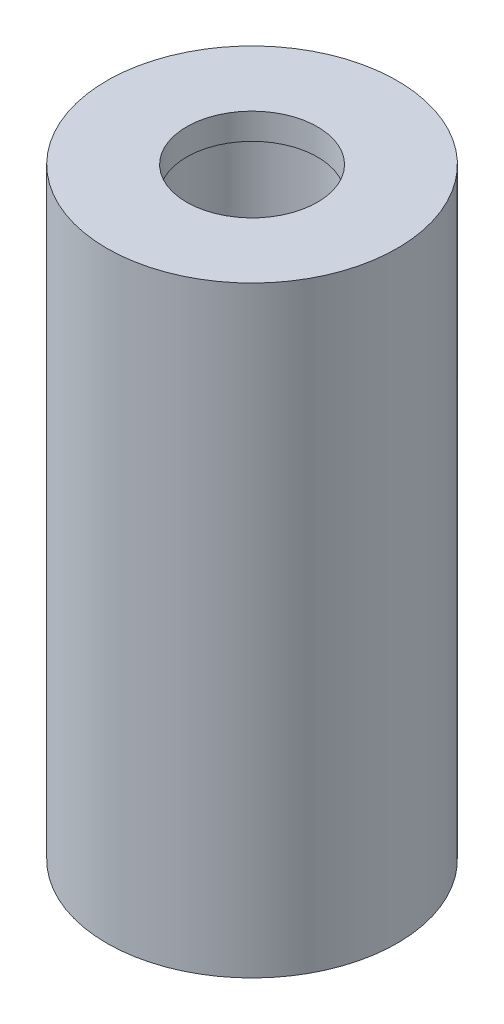
ISO-10303-21;
HEADER;
FILE_DESCRIPTION(('STEP AP214'),'2;1');
FILE_NAME('part.step','',(''),(''),'','','');
FILE_SCHEMA(('AUTOMOTIVE_DESIGN { 1 0 10303 214 1 1 1 1 }'));
ENDSEC;
DATA;
#1=APPLICATION_CONTEXT('core data for automotive mechanical design processes');
#2=APPLICATION_PROTOCOL_DEFINITION('international standard','automotive_design',2000,#1);
#3=PRODUCT_CONTEXT('',#1,'mechanical');
#4=PRODUCT('Part','Part','',(#3));
#5=PRODUCT_RELATED_PRODUCT_CATEGORY('part','',(#4));
#6=PRODUCT_DEFINITION_FORMATION('','',#4);
#7=PRODUCT_DEFINITION_CONTEXT('part definition',#1,'design');
#8=PRODUCT_DEFINITION('design','',#6,#7);
#9=PRODUCT_DEFINITION_SHAPE('','',#8);
#10=(LENGTH_UNIT() NAMED_UNIT(*) SI_UNIT(.MILLI.,.METRE.));
#11=(NAMED_UNIT(*) PLANE_ANGLE_UNIT() SI_UNIT($,.RADIAN.));
#12=(NAMED_UNIT(*) SI_UNIT($,.STERADIAN.) SOLID_ANGLE_UNIT());
#13=UNCERTAINTY_MEASURE_WITH_UNIT(LENGTH_MEASURE(1.E-05),#10,'distance_accuracy_value','');
#14=(GEOMETRIC_REPRESENTATION_CONTEXT(3) GLOBAL_UNCERTAINTY_ASSIGNED_CONTEXT((#13)) GLOBAL_UNIT_ASSIGNED_CONTEXT((#10,
#11,#12)) REPRESENTATION_CONTEXT('',''));
#15=CARTESIAN_POINT('',(0.,0.,0.));
#16=DIRECTION('',(0.,0.,1.));
#17=DIRECTION('',(1.,0.,0.));
#18=AXIS2_PLACEMENT_3D('',#15,#16,#17);
#19=CARTESIAN_POINT('',(0.,23.,0.));
#20=DIRECTION('',(0.,-1.,0.));
#21=DIRECTION('',(0.,0.,-1.));
#22=AXIS2_PLACEMENT_3D('',#19,#20,#21);
#23=CYLINDRICAL_SURFACE('',#22,2.55);
#24=CARTESIAN_POINT('',(0.,0.,0.));
#25=DIRECTION('',(0.,1.,0.));
#26=DIRECTION('',(0.,0.,1.));
#27=AXIS2_PLACEMENT_3D('',#24,#25,#26);
#28=CIRCLE('',#27,2.55);
#29=CARTESIAN_POINT('',(0.,0.,2.55));
#30=VERTEX_POINT('',#29);
#31=EDGE_CURVE('E56',#30,#30,#28,.T.);
#32=ORIENTED_EDGE('',*,*,#31,.F.);
#33=EDGE_LOOP('',(#32));
#34=FACE_BOUND('',#33,.T.);
#35=CARTESIAN_POINT('',(0.,22.,0.));
#36=DIRECTION('',(0.,1.,0.));
#37=DIRECTION('',(0.,0.,1.));
#38=AXIS2_PLACEMENT_3D('',#35,#36,#37);
#39=CIRCLE('',#38,2.55);
#40=CARTESIAN_POINT('',(0.,22.,2.55));
#41=VERTEX_POINT('',#40);
#42=EDGE_CURVE('E61',#41,#41,#39,.T.);
#43=ORIENTED_EDGE('',*,*,#42,.T.);
#44=EDGE_LOOP('',(#43));
#45=FACE_BOUND('',#44,.T.);
#46=ADVANCED_FACE('F43',(#34,#45),#23,.F.);
#47=CARTESIAN_POINT('',(0.,23.,0.));
#48=DIRECTION('',(0.,1.,0.));
#49=DIRECTION('',(0.,0.,1.));
#50=AXIS2_PLACEMENT_3D('',#47,#48,#49);
#51=PLANE('',#50);
#52=CARTESIAN_POINT('',(0.,23.,0.));
#53=DIRECTION('',(0.,1.,0.));
#54=DIRECTION('',(0.,0.,1.));
#55=AXIS2_PLACEMENT_3D('',#52,#53,#54);
#56=CIRCLE('',#55,5.55);
#57=CARTESIAN_POINT('',(0.,23.,5.55));
#58=VERTEX_POINT('',#57);
#59=EDGE_CURVE('E10',#58,#58,#56,.T.);
#60=ORIENTED_EDGE('',*,*,#59,.T.);
#61=EDGE_LOOP('',(#60));
#62=FACE_BOUND('',#61,.T.);
#63=CARTESIAN_POINT('',(0.,23.,0.));
#64=DIRECTION('',(0.,1.,0.));
#65=DIRECTION('',(0.,0.,1.));
#66=AXIS2_PLACEMENT_3D('',#63,#64,#65);
#67=CIRCLE('',#66,2.5);
#68=CARTESIAN_POINT('',(0.,23.,2.5));
#69=VERTEX_POINT('',#68);
#70=EDGE_CURVE('E66',#69,#69,#67,.T.);
#71=ORIENTED_EDGE('',*,*,#70,.F.);
#72=EDGE_LOOP('',(#71));
#73=FACE_BOUND('',#72,.T.);
#74=ADVANCED_FACE('F83',(#62,#73),#51,.T.);
#75=CARTESIAN_POINT('',(0.,0.,0.));
#76=DIRECTION('',(0.,1.,0.));
#77=DIRECTION('',(0.,0.,1.));
#78=AXIS2_PLACEMENT_3D('',#75,#76,#77);
#79=PLANE('',#78);
#80=CARTESIAN_POINT('',(0.,0.,0.));
#81=DIRECTION('',(0.,1.,0.));
#82=DIRECTION('',(0.,0.,1.));
#83=AXIS2_PLACEMENT_3D('',#80,#81,#82);
#84=CIRCLE('',#83,5.55);
#85=CARTESIAN_POINT('',(0.,0.,5.55));
#86=VERTEX_POINT('',#85);
#87=EDGE_CURVE('E47',#86,#86,#84,.T.);
#88=ORIENTED_EDGE('',*,*,#87,.F.);
#89=EDGE_LOOP('',(#88));
#90=FACE_BOUND('',#89,.T.);
#91=ORIENTED_EDGE('',*,*,#31,.T.);
#92=EDGE_LOOP('',(#91));
#93=FACE_BOUND('',#92,.T.);
#94=ADVANCED_FACE('F85',(#90,#93),#79,.F.);
#95=CARTESIAN_POINT('',(0.,23.,0.));
#96=DIRECTION('',(0.,-1.,0.));
#97=DIRECTION('',(0.,0.,-1.));
#98=AXIS2_PLACEMENT_3D('',#95,#96,#97);
#99=CYLINDRICAL_SURFACE('',#98,5.55);
#100=ORIENTED_EDGE('',*,*,#59,.F.);
#101=EDGE_LOOP('',(#100));
#102=FACE_BOUND('',#101,.T.);
#103=ORIENTED_EDGE('',*,*,#87,.T.);
#104=EDGE_LOOP('',(#103));
#105=FACE_BOUND('',#104,.T.);
#106=ADVANCED_FACE('F45',(#102,#105),#99,.T.);
#107=CARTESIAN_POINT('',(0.,22.,0.));
#108=DIRECTION('',(0.,1.,0.));
#109=DIRECTION('',(0.,0.,1.));
#110=AXIS2_PLACEMENT_3D('',#107,#108,#109);
#111=PLANE('',#110);
#112=CARTESIAN_POINT('',(0.,22.,0.));
#113=DIRECTION('',(0.,1.,0.));
#114=DIRECTION('',(0.,0.,1.));
#115=AXIS2_PLACEMENT_3D('',#112,#113,#114);
#116=CIRCLE('',#115,2.5);
#117=CARTESIAN_POINT('',(0.,22.,2.5));
#118=VERTEX_POINT('',#117);
#119=EDGE_CURVE('E65',#118,#118,#116,.T.);
#120=ORIENTED_EDGE('',*,*,#119,.T.);
#121=EDGE_LOOP('',(#120));
#122=FACE_BOUND('',#121,.T.);
#123=ORIENTED_EDGE('',*,*,#42,.F.);
#124=EDGE_LOOP('',(#123));
#125=FACE_BOUND('',#124,.T.);
#126=ADVANCED_FACE('F74',(#122,#125),#111,.F.);
#127=CARTESIAN_POINT('',(0.,22.,0.));
#128=DIRECTION('',(0.,1.,0.));
#129=DIRECTION('',(0.,0.,1.));
#130=AXIS2_PLACEMENT_3D('',#127,#128,#129);
#131=CYLINDRICAL_SURFACE('',#130,2.5);
#132=ORIENTED_EDGE('',*,*,#119,.F.);
#133=EDGE_LOOP('',(#132));
#134=FACE_BOUND('',#133,.T.);
#135=ORIENTED_EDGE('',*,*,#70,.T.);
#136=EDGE_LOOP('',(#135));
#137=FACE_BOUND('',#136,.T.);
#138=ADVANCED_FACE('F77',(#134,#137),#131,.F.);
#139=CLOSED_SHELL('',(#46,#74,#94,#106,#126,#138));
#140=MANIFOLD_SOLID_BREP('B2',#139);
#141=ADVANCED_BREP_SHAPE_REPRESENTATION('',(#18,#140),#14);
#142=SHAPE_DEFINITION_REPRESENTATION(#9,#141);
ENDSEC;
END-ISO-10303-21;
